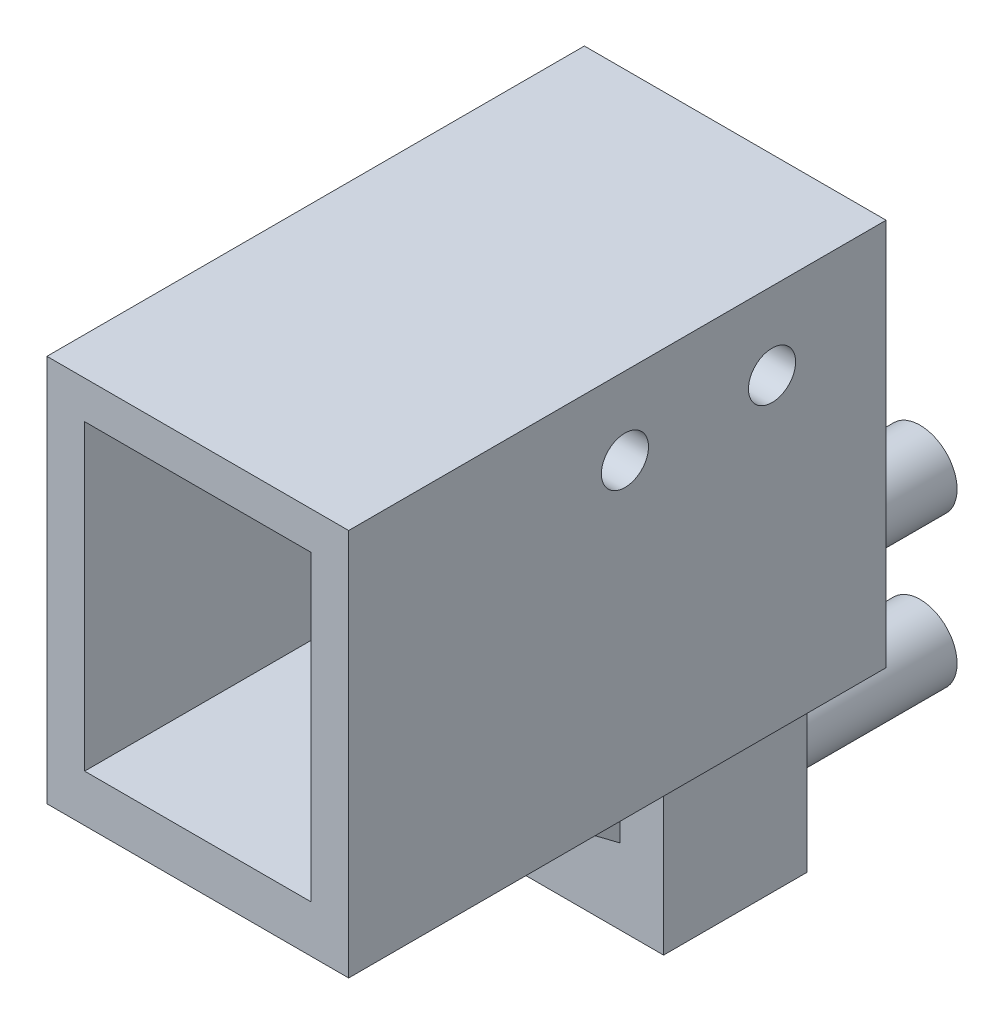
ISO-10303-21;
HEADER;
FILE_DESCRIPTION(('STEP AP214'),'2;1');
FILE_NAME('part.step','',(''),(''),'','','');
FILE_SCHEMA(('AUTOMOTIVE_DESIGN { 1 0 10303 214 1 1 1 1 }'));
ENDSEC;
DATA;
#1=APPLICATION_CONTEXT('core data for automotive mechanical design processes');
#2=APPLICATION_PROTOCOL_DEFINITION('international standard','automotive_design',2000,#1);
#3=PRODUCT_CONTEXT('',#1,'mechanical');
#4=PRODUCT('Part','Part','',(#3));
#5=PRODUCT_RELATED_PRODUCT_CATEGORY('part','',(#4));
#6=PRODUCT_DEFINITION_FORMATION('','',#4);
#7=PRODUCT_DEFINITION_CONTEXT('part definition',#1,'design');
#8=PRODUCT_DEFINITION('design','',#6,#7);
#9=PRODUCT_DEFINITION_SHAPE('','',#8);
#10=(LENGTH_UNIT() NAMED_UNIT(*) SI_UNIT(.MILLI.,.METRE.));
#11=(NAMED_UNIT(*) PLANE_ANGLE_UNIT() SI_UNIT($,.RADIAN.));
#12=(NAMED_UNIT(*) SI_UNIT($,.STERADIAN.) SOLID_ANGLE_UNIT());
#13=UNCERTAINTY_MEASURE_WITH_UNIT(LENGTH_MEASURE(1.E-05),#10,'distance_accuracy_value','');
#14=(GEOMETRIC_REPRESENTATION_CONTEXT(3) GLOBAL_UNCERTAINTY_ASSIGNED_CONTEXT((#13)) GLOBAL_UNIT_ASSIGNED_CONTEXT((#10,
#11,#12)) REPRESENTATION_CONTEXT('',''));
#15=CARTESIAN_POINT('',(0.,0.,0.));
#16=DIRECTION('',(0.,0.,1.));
#17=DIRECTION('',(1.,0.,0.));
#18=AXIS2_PLACEMENT_3D('',#15,#16,#17);
#19=CARTESIAN_POINT('',(0.,14.,0.));
#20=DIRECTION('',(0.,-1.,0.));
#21=DIRECTION('',(0.,0.,-1.));
#22=AXIS2_PLACEMENT_3D('',#19,#20,#21);
#23=PLANE('',#22);
#24=DIRECTION('',(0.,0.,-1.));
#25=VECTOR('',#24,1.);
#26=CARTESIAN_POINT('',(-12.,14.,97.6411649942246));
#27=LINE('',#26,#25);
#28=CARTESIAN_POINT('',(-12.,14.,49.4));
#29=VERTEX_POINT('',#28);
#30=CARTESIAN_POINT('',(-12.,14.,-7.6));
#31=VERTEX_POINT('',#30);
#32=EDGE_CURVE('E200',#29,#31,#27,.T.);
#33=ORIENTED_EDGE('',*,*,#32,.F.);
#34=DIRECTION('',(1.,0.,0.));
#35=VECTOR('',#34,1.);
#36=CARTESIAN_POINT('',(-16.,14.,49.4));
#37=LINE('',#36,#35);
#38=CARTESIAN_POINT('',(12.,14.,49.4));
#39=VERTEX_POINT('',#38);
#40=EDGE_CURVE('E221',#29,#39,#37,.T.);
#41=ORIENTED_EDGE('',*,*,#40,.T.);
#42=DIRECTION('',(0.,0.,-1.));
#43=VECTOR('',#42,1.);
#44=CARTESIAN_POINT('',(12.,14.,97.6411649942246));
#45=LINE('',#44,#43);
#46=CARTESIAN_POINT('',(12.,14.,-7.6));
#47=VERTEX_POINT('',#46);
#48=EDGE_CURVE('E211',#39,#47,#45,.T.);
#49=ORIENTED_EDGE('',*,*,#48,.T.);
#50=DIRECTION('',(-1.,0.,0.));
#51=VECTOR('',#50,1.);
#52=CARTESIAN_POINT('',(-7.6,14.,-7.6));
#53=LINE('',#52,#51);
#54=EDGE_CURVE('E70',#47,#31,#53,.T.);
#55=ORIENTED_EDGE('',*,*,#54,.T.);
#56=EDGE_LOOP('',(#33,#41,#49,#55));
#57=FACE_BOUND('',#56,.T.);
#58=ADVANCED_FACE('F44',(#57),#23,.F.);
#59=CARTESIAN_POINT('',(-7.6,14.,7.6));
#60=DIRECTION('',(1.,0.,0.));
#61=DIRECTION('',(0.,0.,-1.));
#62=AXIS2_PLACEMENT_3D('',#59,#60,#61);
#63=PLANE('',#62);
#64=DIRECTION('',(0.,-1.,0.));
#65=VECTOR('',#64,1.);
#66=CARTESIAN_POINT('',(-7.6,14.,7.6));
#67=LINE('',#66,#65);
#68=CARTESIAN_POINT('',(-7.6,9.,7.6));
#69=VERTEX_POINT('',#68);
#70=CARTESIAN_POINT('',(-7.6,-14.,7.6));
#71=VERTEX_POINT('',#70);
#72=EDGE_CURVE('E11',#69,#71,#67,.T.);
#73=ORIENTED_EDGE('',*,*,#72,.F.);
#74=DIRECTION('',(0.,0.,-1.));
#75=VECTOR('',#74,1.);
#76=CARTESIAN_POINT('',(-7.6,9.,7.6));
#77=LINE('',#76,#75);
#78=CARTESIAN_POINT('',(-7.6,9.,-7.6));
#79=VERTEX_POINT('',#78);
#80=EDGE_CURVE('E284',#69,#79,#77,.T.);
#81=ORIENTED_EDGE('',*,*,#80,.T.);
#82=DIRECTION('',(0.,-1.,0.));
#83=VECTOR('',#82,1.);
#84=CARTESIAN_POINT('',(-7.6,14.,-7.6));
#85=LINE('',#84,#83);
#86=CARTESIAN_POINT('',(-7.6,-14.,-7.6));
#87=VERTEX_POINT('',#86);
#88=EDGE_CURVE('E307',#79,#87,#85,.T.);
#89=ORIENTED_EDGE('',*,*,#88,.T.);
#90=DIRECTION('',(0.,0.,1.));
#91=VECTOR('',#90,1.);
#92=CARTESIAN_POINT('',(-7.6,-14.,7.6));
#93=LINE('',#92,#91);
#94=EDGE_CURVE('E301',#87,#71,#93,.T.);
#95=ORIENTED_EDGE('',*,*,#94,.T.);
#96=EDGE_LOOP('',(#73,#81,#89,#95));
#97=FACE_BOUND('',#96,.T.);
#98=ADVANCED_FACE('F46',(#97),#63,.F.);
#99=CARTESIAN_POINT('',(-7.6,14.,7.6));
#100=DIRECTION('',(0.,0.,-1.));
#101=DIRECTION('',(-1.,0.,0.));
#102=AXIS2_PLACEMENT_3D('',#99,#100,#101);
#103=PLANE('',#102);
#104=DIRECTION('',(-1.,0.,0.));
#105=VECTOR('',#104,1.);
#106=CARTESIAN_POINT('',(-7.6,9.,7.6));
#107=LINE('',#106,#105);
#108=CARTESIAN_POINT('',(7.6,9.,7.6));
#109=VERTEX_POINT('',#108);
#110=CARTESIAN_POINT('',(3.,9.,7.6));
#111=VERTEX_POINT('',#110);
#112=EDGE_CURVE('E177',#109,#111,#107,.T.);
#113=ORIENTED_EDGE('',*,*,#112,.T.);
#114=DIRECTION('',(0.,1.,0.));
#115=VECTOR('',#114,1.);
#116=CARTESIAN_POINT('',(3.,-6.,7.6));
#117=LINE('',#116,#115);
#118=CARTESIAN_POINT('',(3.,-6.,7.6));
#119=VERTEX_POINT('',#118);
#120=EDGE_CURVE('E157',#119,#111,#117,.T.);
#121=ORIENTED_EDGE('',*,*,#120,.F.);
#122=DIRECTION('',(-1.,0.,0.));
#123=VECTOR('',#122,1.);
#124=CARTESIAN_POINT('',(3.,-6.,7.6));
#125=LINE('',#124,#123);
#126=CARTESIAN_POINT('',(-3.,-6.,7.6));
#127=VERTEX_POINT('',#126);
#128=EDGE_CURVE('E166',#119,#127,#125,.T.);
#129=ORIENTED_EDGE('',*,*,#128,.T.);
#130=DIRECTION('',(0.,1.,0.));
#131=VECTOR('',#130,1.);
#132=CARTESIAN_POINT('',(-3.,-6.,7.6));
#133=LINE('',#132,#131);
#134=CARTESIAN_POINT('',(-3.,9.,7.6));
#135=VERTEX_POINT('',#134);
#136=EDGE_CURVE('E186',#127,#135,#133,.T.);
#137=ORIENTED_EDGE('',*,*,#136,.T.);
#138=EDGE_CURVE('E281',#135,#69,#107,.T.);
#139=ORIENTED_EDGE('',*,*,#138,.T.);
#140=ORIENTED_EDGE('',*,*,#72,.T.);
#141=DIRECTION('',(1.,0.,0.));
#142=VECTOR('',#141,1.);
#143=CARTESIAN_POINT('',(-7.6,-14.,7.6));
#144=LINE('',#143,#142);
#145=CARTESIAN_POINT('',(7.6,-14.,7.6));
#146=VERTEX_POINT('',#145);
#147=EDGE_CURVE('E312',#71,#146,#144,.T.);
#148=ORIENTED_EDGE('',*,*,#147,.T.);
#149=DIRECTION('',(0.,-1.,0.));
#150=VECTOR('',#149,1.);
#151=CARTESIAN_POINT('',(7.6,14.,7.6));
#152=LINE('',#151,#150);
#153=EDGE_CURVE('E54',#109,#146,#152,.T.);
#154=ORIENTED_EDGE('',*,*,#153,.F.);
#155=EDGE_LOOP('',(#113,#121,#129,#137,#139,#140,#148,#154));
#156=FACE_BOUND('',#155,.T.);
#157=ADVANCED_FACE('F175',(#156),#103,.F.);
#158=CARTESIAN_POINT('',(7.6,14.,7.6));
#159=DIRECTION('',(-1.,0.,0.));
#160=DIRECTION('',(0.,0.,1.));
#161=AXIS2_PLACEMENT_3D('',#158,#159,#160);
#162=PLANE('',#161);
#163=DIRECTION('',(0.,-1.,0.));
#164=VECTOR('',#163,1.);
#165=CARTESIAN_POINT('',(7.6,14.,-7.6));
#166=LINE('',#165,#164);
#167=CARTESIAN_POINT('',(7.6,9.,-7.6));
#168=VERTEX_POINT('',#167);
#169=CARTESIAN_POINT('',(7.6,-14.,-7.6));
#170=VERTEX_POINT('',#169);
#171=EDGE_CURVE('E325',#168,#170,#166,.T.);
#172=ORIENTED_EDGE('',*,*,#171,.F.);
#173=DIRECTION('',(0.,0.,1.));
#174=VECTOR('',#173,1.);
#175=CARTESIAN_POINT('',(7.6,9.,7.6));
#176=LINE('',#175,#174);
#177=EDGE_CURVE('E269',#168,#109,#176,.T.);
#178=ORIENTED_EDGE('',*,*,#177,.T.);
#179=ORIENTED_EDGE('',*,*,#153,.T.);
#180=DIRECTION('',(0.,0.,-1.));
#181=VECTOR('',#180,1.);
#182=CARTESIAN_POINT('',(7.6,-14.,7.6));
#183=LINE('',#182,#181);
#184=EDGE_CURVE('E316',#146,#170,#183,.T.);
#185=ORIENTED_EDGE('',*,*,#184,.T.);
#186=EDGE_LOOP('',(#172,#178,#179,#185));
#187=FACE_BOUND('',#186,.T.);
#188=ADVANCED_FACE('F400',(#187),#162,.F.);
#189=CARTESIAN_POINT('',(-7.6,14.,-7.6));
#190=DIRECTION('',(0.,0.,1.));
#191=DIRECTION('',(1.,0.,0.));
#192=AXIS2_PLACEMENT_3D('',#189,#190,#191);
#193=PLANE('',#192);
#194=DIRECTION('',(0.,1.,0.));
#195=VECTOR('',#194,1.);
#196=CARTESIAN_POINT('',(-12.,0.,-7.6));
#197=LINE('',#196,#195);
#198=CARTESIAN_POINT('',(-12.,46.1,-7.6));
#199=VERTEX_POINT('',#198);
#200=EDGE_CURVE('E195',#31,#199,#197,.T.);
#201=ORIENTED_EDGE('',*,*,#200,.F.);
#202=ORIENTED_EDGE('',*,*,#54,.F.);
#203=DIRECTION('',(0.,-1.,0.));
#204=VECTOR('',#203,1.);
#205=CARTESIAN_POINT('',(12.,0.,-7.6));
#206=LINE('',#205,#204);
#207=CARTESIAN_POINT('',(12.,46.1,-7.6));
#208=VERTEX_POINT('',#207);
#209=EDGE_CURVE('E207',#208,#47,#206,.T.);
#210=ORIENTED_EDGE('',*,*,#209,.F.);
#211=DIRECTION('',(-1.,0.,0.));
#212=VECTOR('',#211,1.);
#213=CARTESIAN_POINT('',(0.,46.1,-7.6));
#214=LINE('',#213,#212);
#215=EDGE_CURVE('E201',#208,#199,#214,.T.);
#216=ORIENTED_EDGE('',*,*,#215,.T.);
#217=EDGE_LOOP('',(#201,#202,#210,#216));
#218=FACE_BOUND('',#217,.T.);
#219=CARTESIAN_POINT('',(0.,9.55,-7.6));
#220=DIRECTION('',(0.,0.,1.));
#221=DIRECTION('',(1.,0.,0.));
#222=AXIS2_PLACEMENT_3D('',#219,#220,#221);
#223=CIRCLE('',#222,3.925);
#224=CARTESIAN_POINT('',(3.925,9.55,-7.6));
#225=VERTEX_POINT('',#224);
#226=EDGE_CURVE('E289',#225,#225,#223,.T.);
#227=ORIENTED_EDGE('',*,*,#226,.T.);
#228=EDGE_LOOP('',(#227));
#229=FACE_BOUND('',#228,.T.);
#230=ORIENTED_EDGE('',*,*,#88,.F.);
#231=DIRECTION('',(-1.,0.,0.));
#232=VECTOR('',#231,1.);
#233=CARTESIAN_POINT('',(-16.,9.,-7.6));
#234=LINE('',#233,#232);
#235=CARTESIAN_POINT('',(-16.,9.,-7.6));
#236=VERTEX_POINT('',#235);
#237=EDGE_CURVE('E258',#79,#236,#234,.T.);
#238=ORIENTED_EDGE('',*,*,#237,.T.);
#239=DIRECTION('',(0.,1.,0.));
#240=VECTOR('',#239,1.);
#241=CARTESIAN_POINT('',(-16.,9.,-7.6));
#242=LINE('',#241,#240);
#243=CARTESIAN_POINT('',(-16.,50.1,-7.6));
#244=VERTEX_POINT('',#243);
#245=EDGE_CURVE('E266',#236,#244,#242,.T.);
#246=ORIENTED_EDGE('',*,*,#245,.T.);
#247=DIRECTION('',(-1.,0.,0.));
#248=VECTOR('',#247,1.);
#249=CARTESIAN_POINT('',(0.,50.1,-7.6));
#250=LINE('',#249,#248);
#251=CARTESIAN_POINT('',(16.,50.1,-7.6));
#252=VERTEX_POINT('',#251);
#253=EDGE_CURVE('E206',#252,#244,#250,.T.);
#254=ORIENTED_EDGE('',*,*,#253,.F.);
#255=DIRECTION('',(0.,1.,0.));
#256=VECTOR('',#255,1.);
#257=CARTESIAN_POINT('',(16.,9.,-7.6));
#258=LINE('',#257,#256);
#259=CARTESIAN_POINT('',(16.,9.,-7.6));
#260=VERTEX_POINT('',#259);
#261=EDGE_CURVE('E270',#260,#252,#258,.T.);
#262=ORIENTED_EDGE('',*,*,#261,.F.);
#263=EDGE_CURVE('E259',#260,#168,#234,.T.);
#264=ORIENTED_EDGE('',*,*,#263,.T.);
#265=ORIENTED_EDGE('',*,*,#171,.T.);
#266=DIRECTION('',(-1.,0.,0.));
#267=VECTOR('',#266,1.);
#268=CARTESIAN_POINT('',(-7.6,-14.,-7.6));
#269=LINE('',#268,#267);
#270=EDGE_CURVE('E308',#170,#87,#269,.T.);
#271=ORIENTED_EDGE('',*,*,#270,.T.);
#272=EDGE_LOOP('',(#230,#238,#246,#254,#262,#264,#265,#271));
#273=FACE_BOUND('',#272,.T.);
#274=CARTESIAN_POINT('',(0.,-6.45,-7.6));
#275=DIRECTION('',(0.,0.,1.));
#276=DIRECTION('',(1.,0.,0.));
#277=AXIS2_PLACEMENT_3D('',#274,#275,#276);
#278=CIRCLE('',#277,3.925);
#279=CARTESIAN_POINT('',(3.925,-6.45,-7.6));
#280=VERTEX_POINT('',#279);
#281=EDGE_CURVE('E293',#280,#280,#278,.T.);
#282=ORIENTED_EDGE('',*,*,#281,.T.);
#283=EDGE_LOOP('',(#282));
#284=FACE_BOUND('',#283,.T.);
#285=ADVANCED_FACE('F396',(#218,#229,#273,#284),#193,.F.);
#286=CARTESIAN_POINT('',(0.,-14.,0.));
#287=DIRECTION('',(0.,-1.,0.));
#288=DIRECTION('',(0.,0.,-1.));
#289=AXIS2_PLACEMENT_3D('',#286,#287,#288);
#290=PLANE('',#289);
#291=ORIENTED_EDGE('',*,*,#94,.F.);
#292=ORIENTED_EDGE('',*,*,#270,.F.);
#293=ORIENTED_EDGE('',*,*,#184,.F.);
#294=ORIENTED_EDGE('',*,*,#147,.F.);
#295=EDGE_LOOP('',(#291,#292,#293,#294));
#296=FACE_BOUND('',#295,.T.);
#297=ADVANCED_FACE('F393',(#296),#290,.T.);
#298=CARTESIAN_POINT('',(0.,-6.45,-27.2));
#299=DIRECTION('',(0.,0.,1.));
#300=DIRECTION('',(1.,0.,0.));
#301=AXIS2_PLACEMENT_3D('',#298,#299,#300);
#302=CYLINDRICAL_SURFACE('',#301,3.925);
#303=CARTESIAN_POINT('',(0.,-6.45,-27.2));
#304=DIRECTION('',(0.,0.,1.));
#305=DIRECTION('',(1.,0.,0.));
#306=AXIS2_PLACEMENT_3D('',#303,#304,#305);
#307=CIRCLE('',#306,3.925);
#308=CARTESIAN_POINT('',(3.925,-6.45,-27.2));
#309=VERTEX_POINT('',#308);
#310=EDGE_CURVE('E297',#309,#309,#307,.T.);
#311=ORIENTED_EDGE('',*,*,#310,.T.);
#312=EDGE_LOOP('',(#311));
#313=FACE_BOUND('',#312,.T.);
#314=ORIENTED_EDGE('',*,*,#281,.F.);
#315=EDGE_LOOP('',(#314));
#316=FACE_BOUND('',#315,.T.);
#317=ADVANCED_FACE('F391',(#313,#316),#302,.T.);
#318=CARTESIAN_POINT('',(0.,-6.45,-27.2));
#319=DIRECTION('',(0.,0.,1.));
#320=DIRECTION('',(1.,0.,0.));
#321=AXIS2_PLACEMENT_3D('',#318,#319,#320);
#322=PLANE('',#321);
#323=ORIENTED_EDGE('',*,*,#310,.F.);
#324=EDGE_LOOP('',(#323));
#325=FACE_BOUND('',#324,.T.);
#326=ADVANCED_FACE('F431',(#325),#322,.F.);
#327=CARTESIAN_POINT('',(0.,9.55,-27.2));
#328=DIRECTION('',(0.,0.,1.));
#329=DIRECTION('',(1.,0.,0.));
#330=AXIS2_PLACEMENT_3D('',#327,#328,#329);
#331=CYLINDRICAL_SURFACE('',#330,3.925);
#332=CARTESIAN_POINT('',(0.,9.55,-27.2));
#333=DIRECTION('',(0.,0.,1.));
#334=DIRECTION('',(1.,0.,0.));
#335=AXIS2_PLACEMENT_3D('',#332,#333,#334);
#336=CIRCLE('',#335,3.925);
#337=CARTESIAN_POINT('',(3.925,9.55,-27.2));
#338=VERTEX_POINT('',#337);
#339=EDGE_CURVE('E288',#338,#338,#336,.T.);
#340=ORIENTED_EDGE('',*,*,#339,.T.);
#341=EDGE_LOOP('',(#340));
#342=FACE_BOUND('',#341,.T.);
#343=ORIENTED_EDGE('',*,*,#226,.F.);
#344=EDGE_LOOP('',(#343));
#345=FACE_BOUND('',#344,.T.);
#346=ADVANCED_FACE('F438',(#342,#345),#331,.T.);
#347=CARTESIAN_POINT('',(0.,9.55,-27.2));
#348=DIRECTION('',(0.,0.,1.));
#349=DIRECTION('',(1.,0.,0.));
#350=AXIS2_PLACEMENT_3D('',#347,#348,#349);
#351=PLANE('',#350);
#352=ORIENTED_EDGE('',*,*,#339,.F.);
#353=EDGE_LOOP('',(#352));
#354=FACE_BOUND('',#353,.T.);
#355=ADVANCED_FACE('F445',(#354),#351,.F.);
#356=CARTESIAN_POINT('',(0.,9.,0.));
#357=DIRECTION('',(0.,-1.,0.));
#358=DIRECTION('',(0.,0.,-1.));
#359=AXIS2_PLACEMENT_3D('',#356,#357,#358);
#360=PLANE('',#359);
#361=DIRECTION('',(0.,0.,1.));
#362=VECTOR('',#361,1.);
#363=CARTESIAN_POINT('',(3.,9.,7.6));
#364=LINE('',#363,#362);
#365=CARTESIAN_POINT('',(3.,9.,27.6));
#366=VERTEX_POINT('',#365);
#367=EDGE_CURVE('E159',#111,#366,#364,.T.);
#368=ORIENTED_EDGE('',*,*,#367,.F.);
#369=ORIENTED_EDGE('',*,*,#112,.F.);
#370=ORIENTED_EDGE('',*,*,#177,.F.);
#371=ORIENTED_EDGE('',*,*,#263,.F.);
#372=DIRECTION('',(0.,0.,-1.));
#373=VECTOR('',#372,1.);
#374=CARTESIAN_POINT('',(16.,9.,49.4));
#375=LINE('',#374,#373);
#376=CARTESIAN_POINT('',(16.,9.,49.4));
#377=VERTEX_POINT('',#376);
#378=EDGE_CURVE('E254',#377,#260,#375,.T.);
#379=ORIENTED_EDGE('',*,*,#378,.F.);
#380=DIRECTION('',(1.,0.,0.));
#381=VECTOR('',#380,1.);
#382=CARTESIAN_POINT('',(-16.,9.,49.4));
#383=LINE('',#382,#381);
#384=CARTESIAN_POINT('',(-16.,9.,49.4));
#385=VERTEX_POINT('',#384);
#386=EDGE_CURVE('E250',#385,#377,#383,.T.);
#387=ORIENTED_EDGE('',*,*,#386,.F.);
#388=DIRECTION('',(0.,0.,1.));
#389=VECTOR('',#388,1.);
#390=CARTESIAN_POINT('',(-16.,9.,49.4));
#391=LINE('',#390,#389);
#392=EDGE_CURVE('E246',#236,#385,#391,.T.);
#393=ORIENTED_EDGE('',*,*,#392,.F.);
#394=ORIENTED_EDGE('',*,*,#237,.F.);
#395=ORIENTED_EDGE('',*,*,#80,.F.);
#396=ORIENTED_EDGE('',*,*,#138,.F.);
#397=DIRECTION('',(0.,0.,1.));
#398=VECTOR('',#397,1.);
#399=CARTESIAN_POINT('',(-3.,9.,7.6));
#400=LINE('',#399,#398);
#401=CARTESIAN_POINT('',(-3.,9.,27.6));
#402=VERTEX_POINT('',#401);
#403=EDGE_CURVE('E163',#135,#402,#400,.T.);
#404=ORIENTED_EDGE('',*,*,#403,.T.);
#405=DIRECTION('',(-1.,0.,0.));
#406=VECTOR('',#405,1.);
#407=CARTESIAN_POINT('',(3.,9.,27.6));
#408=LINE('',#407,#406);
#409=EDGE_CURVE('E172',#366,#402,#408,.T.);
#410=ORIENTED_EDGE('',*,*,#409,.F.);
#411=EDGE_LOOP('',(#368,#369,#370,#371,#379,#387,#393,#394,#395,#396,#404,#410));
#412=FACE_BOUND('',#411,.T.);
#413=ADVANCED_FACE('F452',(#412),#360,.T.);
#414=CARTESIAN_POINT('',(-16.,9.,49.4));
#415=DIRECTION('',(-1.,0.,0.));
#416=DIRECTION('',(0.,0.,1.));
#417=AXIS2_PLACEMENT_3D('',#414,#415,#416);
#418=PLANE('',#417);
#419=CARTESIAN_POINT('',(-16.,41.9,20.1));
#420=DIRECTION('',(1.,0.,0.));
#421=DIRECTION('',(0.,0.,-1.));
#422=AXIS2_PLACEMENT_3D('',#419,#420,#421);
#423=CIRCLE('',#422,2.5);
#424=CARTESIAN_POINT('',(-16.,41.9,17.6));
#425=VERTEX_POINT('',#424);
#426=EDGE_CURVE('E333',#425,#425,#423,.T.);
#427=ORIENTED_EDGE('',*,*,#426,.T.);
#428=EDGE_LOOP('',(#427));
#429=FACE_BOUND('',#428,.T.);
#430=CARTESIAN_POINT('',(-16.,41.9,4.5));
#431=DIRECTION('',(1.,0.,0.));
#432=DIRECTION('',(0.,0.,-1.));
#433=AXIS2_PLACEMENT_3D('',#430,#431,#432);
#434=CIRCLE('',#433,2.5);
#435=CARTESIAN_POINT('',(-16.,41.9,2.));
#436=VERTEX_POINT('',#435);
#437=EDGE_CURVE('E350',#436,#436,#434,.T.);
#438=ORIENTED_EDGE('',*,*,#437,.T.);
#439=EDGE_LOOP('',(#438));
#440=FACE_BOUND('',#439,.T.);
#441=DIRECTION('',(0.,1.,0.));
#442=VECTOR('',#441,1.);
#443=CARTESIAN_POINT('',(-16.,9.,49.4));
#444=LINE('',#443,#442);
#445=CARTESIAN_POINT('',(-16.,50.1,49.4));
#446=VERTEX_POINT('',#445);
#447=EDGE_CURVE('E263',#385,#446,#444,.T.);
#448=ORIENTED_EDGE('',*,*,#447,.T.);
#449=DIRECTION('',(0.,0.,-1.));
#450=VECTOR('',#449,1.);
#451=CARTESIAN_POINT('',(-16.,50.1,97.6411649942246));
#452=LINE('',#451,#450);
#453=EDGE_CURVE('E171',#446,#244,#452,.T.);
#454=ORIENTED_EDGE('',*,*,#453,.T.);
#455=ORIENTED_EDGE('',*,*,#245,.F.);
#456=ORIENTED_EDGE('',*,*,#392,.T.);
#457=EDGE_LOOP('',(#448,#454,#455,#456));
#458=FACE_BOUND('',#457,.T.);
#459=ADVANCED_FACE('F459',(#429,#440,#458),#418,.T.);
#460=CARTESIAN_POINT('',(16.,9.,49.4));
#461=DIRECTION('',(1.,0.,0.));
#462=DIRECTION('',(0.,0.,-1.));
#463=AXIS2_PLACEMENT_3D('',#460,#461,#462);
#464=PLANE('',#463);
#465=CARTESIAN_POINT('',(16.,41.9,20.1));
#466=DIRECTION('',(1.,0.,0.));
#467=DIRECTION('',(0.,0.,-1.));
#468=AXIS2_PLACEMENT_3D('',#465,#466,#467);
#469=CIRCLE('',#468,2.5);
#470=CARTESIAN_POINT('',(16.,41.9,17.6));
#471=VERTEX_POINT('',#470);
#472=EDGE_CURVE('E341',#471,#471,#469,.T.);
#473=ORIENTED_EDGE('',*,*,#472,.F.);
#474=EDGE_LOOP('',(#473));
#475=FACE_BOUND('',#474,.T.);
#476=CARTESIAN_POINT('',(16.,41.9,4.5));
#477=DIRECTION('',(1.,0.,0.));
#478=DIRECTION('',(0.,0.,-1.));
#479=AXIS2_PLACEMENT_3D('',#476,#477,#478);
#480=CIRCLE('',#479,2.5);
#481=CARTESIAN_POINT('',(16.,41.9,2.));
#482=VERTEX_POINT('',#481);
#483=EDGE_CURVE('E347',#482,#482,#480,.T.);
#484=ORIENTED_EDGE('',*,*,#483,.F.);
#485=EDGE_LOOP('',(#484));
#486=FACE_BOUND('',#485,.T.);
#487=ORIENTED_EDGE('',*,*,#261,.T.);
#488=DIRECTION('',(0.,0.,-1.));
#489=VECTOR('',#488,1.);
#490=CARTESIAN_POINT('',(16.,50.1,97.6411649942246));
#491=LINE('',#490,#489);
#492=CARTESIAN_POINT('',(16.,50.1,49.4));
#493=VERTEX_POINT('',#492);
#494=EDGE_CURVE('E216',#493,#252,#491,.T.);
#495=ORIENTED_EDGE('',*,*,#494,.F.);
#496=DIRECTION('',(0.,1.,0.));
#497=VECTOR('',#496,1.);
#498=CARTESIAN_POINT('',(16.,9.,49.4));
#499=LINE('',#498,#497);
#500=EDGE_CURVE('E273',#377,#493,#499,.T.);
#501=ORIENTED_EDGE('',*,*,#500,.F.);
#502=ORIENTED_EDGE('',*,*,#378,.T.);
#503=EDGE_LOOP('',(#487,#495,#501,#502));
#504=FACE_BOUND('',#503,.T.);
#505=ADVANCED_FACE('F469',(#475,#486,#504),#464,.T.);
#506=CARTESIAN_POINT('',(-16.,9.,49.4));
#507=DIRECTION('',(0.,0.,1.));
#508=DIRECTION('',(1.,0.,0.));
#509=AXIS2_PLACEMENT_3D('',#506,#507,#508);
#510=PLANE('',#509);
#511=ORIENTED_EDGE('',*,*,#40,.F.);
#512=DIRECTION('',(0.,1.,0.));
#513=VECTOR('',#512,1.);
#514=CARTESIAN_POINT('',(-12.,0.,49.4));
#515=LINE('',#514,#513);
#516=CARTESIAN_POINT('',(-12.,46.1,49.4));
#517=VERTEX_POINT('',#516);
#518=EDGE_CURVE('E222',#29,#517,#515,.T.);
#519=ORIENTED_EDGE('',*,*,#518,.T.);
#520=DIRECTION('',(-1.,0.,0.));
#521=VECTOR('',#520,1.);
#522=CARTESIAN_POINT('',(0.,46.1,49.4));
#523=LINE('',#522,#521);
#524=CARTESIAN_POINT('',(12.,46.1,49.4));
#525=VERTEX_POINT('',#524);
#526=EDGE_CURVE('E199',#525,#517,#523,.T.);
#527=ORIENTED_EDGE('',*,*,#526,.F.);
#528=DIRECTION('',(0.,-1.,0.));
#529=VECTOR('',#528,1.);
#530=CARTESIAN_POINT('',(12.,0.,49.4));
#531=LINE('',#530,#529);
#532=EDGE_CURVE('E217',#525,#39,#531,.T.);
#533=ORIENTED_EDGE('',*,*,#532,.T.);
#534=EDGE_LOOP('',(#511,#519,#527,#533));
#535=FACE_BOUND('',#534,.T.);
#536=DIRECTION('',(-1.,0.,0.));
#537=VECTOR('',#536,1.);
#538=CARTESIAN_POINT('',(0.,50.1,49.4));
#539=LINE('',#538,#537);
#540=EDGE_CURVE('E205',#493,#446,#539,.T.);
#541=ORIENTED_EDGE('',*,*,#540,.T.);
#542=ORIENTED_EDGE('',*,*,#447,.F.);
#543=ORIENTED_EDGE('',*,*,#386,.T.);
#544=ORIENTED_EDGE('',*,*,#500,.T.);
#545=EDGE_LOOP('',(#541,#542,#543,#544));
#546=FACE_BOUND('',#545,.T.);
#547=ADVANCED_FACE('F481',(#535,#546),#510,.T.);
#548=CARTESIAN_POINT('',(-12.,0.,97.6411649942246));
#549=DIRECTION('',(-1.,0.,0.));
#550=DIRECTION('',(0.,-1.,0.));
#551=AXIS2_PLACEMENT_3D('',#548,#549,#550);
#552=PLANE('',#551);
#553=CARTESIAN_POINT('',(-12.,41.9,20.1));
#554=DIRECTION('',(-1.,0.,0.));
#555=DIRECTION('',(0.,-1.,0.));
#556=AXIS2_PLACEMENT_3D('',#553,#554,#555);
#557=CIRCLE('',#556,2.5);
#558=CARTESIAN_POINT('',(-12.,39.4,20.1));
#559=VERTEX_POINT('',#558);
#560=EDGE_CURVE('E187',#559,#559,#557,.T.);
#561=ORIENTED_EDGE('',*,*,#560,.T.);
#562=EDGE_LOOP('',(#561));
#563=FACE_BOUND('',#562,.T.);
#564=CARTESIAN_POINT('',(-12.,41.9,4.5));
#565=DIRECTION('',(-1.,0.,0.));
#566=DIRECTION('',(0.,-1.,0.));
#567=AXIS2_PLACEMENT_3D('',#564,#565,#566);
#568=CIRCLE('',#567,2.5);
#569=CARTESIAN_POINT('',(-12.,39.4,4.5));
#570=VERTEX_POINT('',#569);
#571=EDGE_CURVE('E332',#570,#570,#568,.T.);
#572=ORIENTED_EDGE('',*,*,#571,.T.);
#573=EDGE_LOOP('',(#572));
#574=FACE_BOUND('',#573,.T.);
#575=ORIENTED_EDGE('',*,*,#518,.F.);
#576=ORIENTED_EDGE('',*,*,#32,.T.);
#577=ORIENTED_EDGE('',*,*,#200,.T.);
#578=DIRECTION('',(0.,0.,-1.));
#579=VECTOR('',#578,1.);
#580=CARTESIAN_POINT('',(-12.,46.1,97.6411649942246));
#581=LINE('',#580,#579);
#582=EDGE_CURVE('E225',#517,#199,#581,.T.);
#583=ORIENTED_EDGE('',*,*,#582,.F.);
#584=EDGE_LOOP('',(#575,#576,#577,#583));
#585=FACE_BOUND('',#584,.T.);
#586=ADVANCED_FACE('F491',(#563,#574,#585),#552,.F.);
#587=CARTESIAN_POINT('',(0.,46.1,97.6411649942246));
#588=DIRECTION('',(0.,-1.,0.));
#589=DIRECTION('',(0.,0.,-1.));
#590=AXIS2_PLACEMENT_3D('',#587,#588,#589);
#591=PLANE('',#590);
#592=DIRECTION('',(0.,0.,-1.));
#593=VECTOR('',#592,1.);
#594=CARTESIAN_POINT('',(12.,46.1,97.6411649942246));
#595=LINE('',#594,#593);
#596=EDGE_CURVE('E212',#525,#208,#595,.T.);
#597=ORIENTED_EDGE('',*,*,#596,.F.);
#598=ORIENTED_EDGE('',*,*,#526,.T.);
#599=ORIENTED_EDGE('',*,*,#582,.T.);
#600=ORIENTED_EDGE('',*,*,#215,.F.);
#601=EDGE_LOOP('',(#597,#598,#599,#600));
#602=FACE_BOUND('',#601,.T.);
#603=ADVANCED_FACE('F499',(#602),#591,.T.);
#604=CARTESIAN_POINT('',(12.,0.,97.6411649942246));
#605=DIRECTION('',(1.,0.,0.));
#606=DIRECTION('',(0.,1.,0.));
#607=AXIS2_PLACEMENT_3D('',#604,#605,#606);
#608=PLANE('',#607);
#609=CARTESIAN_POINT('',(12.,41.9,20.1));
#610=DIRECTION('',(1.,0.,0.));
#611=DIRECTION('',(0.,1.,0.));
#612=AXIS2_PLACEMENT_3D('',#609,#610,#611);
#613=CIRCLE('',#612,2.5);
#614=CARTESIAN_POINT('',(12.,44.4,20.1));
#615=VERTEX_POINT('',#614);
#616=EDGE_CURVE('E48',#615,#615,#613,.T.);
#617=ORIENTED_EDGE('',*,*,#616,.T.);
#618=EDGE_LOOP('',(#617));
#619=FACE_BOUND('',#618,.T.);
#620=CARTESIAN_POINT('',(12.,41.9,4.5));
#621=DIRECTION('',(1.,0.,0.));
#622=DIRECTION('',(0.,1.,0.));
#623=AXIS2_PLACEMENT_3D('',#620,#621,#622);
#624=CIRCLE('',#623,2.5);
#625=CARTESIAN_POINT('',(12.,44.4,4.5));
#626=VERTEX_POINT('',#625);
#627=EDGE_CURVE('E329',#626,#626,#624,.T.);
#628=ORIENTED_EDGE('',*,*,#627,.T.);
#629=EDGE_LOOP('',(#628));
#630=FACE_BOUND('',#629,.T.);
#631=ORIENTED_EDGE('',*,*,#532,.F.);
#632=ORIENTED_EDGE('',*,*,#596,.T.);
#633=ORIENTED_EDGE('',*,*,#209,.T.);
#634=ORIENTED_EDGE('',*,*,#48,.F.);
#635=EDGE_LOOP('',(#631,#632,#633,#634));
#636=FACE_BOUND('',#635,.T.);
#637=ADVANCED_FACE('F364',(#619,#630,#636),#608,.F.);
#638=CARTESIAN_POINT('',(0.,50.1,97.6411649942246));
#639=DIRECTION('',(0.,-1.,0.));
#640=DIRECTION('',(0.,0.,-1.));
#641=AXIS2_PLACEMENT_3D('',#638,#639,#640);
#642=PLANE('',#641);
#643=ORIENTED_EDGE('',*,*,#540,.F.);
#644=ORIENTED_EDGE('',*,*,#494,.T.);
#645=ORIENTED_EDGE('',*,*,#253,.T.);
#646=ORIENTED_EDGE('',*,*,#453,.F.);
#647=EDGE_LOOP('',(#643,#644,#645,#646));
#648=FACE_BOUND('',#647,.T.);
#649=ADVANCED_FACE('F515',(#648),#642,.F.);
#650=CARTESIAN_POINT('',(3.,9.,27.6));
#651=DIRECTION('',(0.,0.8,-0.6));
#652=DIRECTION('',(0.,0.6,0.8));
#653=AXIS2_PLACEMENT_3D('',#650,#651,#652);
#654=PLANE('',#653);
#655=DIRECTION('',(0.,-0.6,-0.8));
#656=VECTOR('',#655,1.);
#657=CARTESIAN_POINT('',(-3.,9.,27.6));
#658=LINE('',#657,#656);
#659=EDGE_CURVE('E62',#402,#127,#658,.T.);
#660=ORIENTED_EDGE('',*,*,#659,.T.);
#661=ORIENTED_EDGE('',*,*,#128,.F.);
#662=DIRECTION('',(0.,-0.6,-0.8));
#663=VECTOR('',#662,1.);
#664=CARTESIAN_POINT('',(3.,9.,27.6));
#665=LINE('',#664,#663);
#666=EDGE_CURVE('E153',#366,#119,#665,.T.);
#667=ORIENTED_EDGE('',*,*,#666,.F.);
#668=ORIENTED_EDGE('',*,*,#409,.T.);
#669=EDGE_LOOP('',(#660,#661,#667,#668));
#670=FACE_BOUND('',#669,.T.);
#671=ADVANCED_FACE('F167',(#670),#654,.F.);
#672=CARTESIAN_POINT('',(3.,0.,0.));
#673=DIRECTION('',(1.,0.,0.));
#674=DIRECTION('',(0.,0.,-1.));
#675=AXIS2_PLACEMENT_3D('',#672,#673,#674);
#676=PLANE('',#675);
#677=ORIENTED_EDGE('',*,*,#666,.T.);
#678=ORIENTED_EDGE('',*,*,#120,.T.);
#679=ORIENTED_EDGE('',*,*,#367,.T.);
#680=EDGE_LOOP('',(#677,#678,#679));
#681=FACE_BOUND('',#680,.T.);
#682=ADVANCED_FACE('F155',(#681),#676,.T.);
#683=CARTESIAN_POINT('',(-3.,0.,0.));
#684=DIRECTION('',(1.,0.,0.));
#685=DIRECTION('',(0.,0.,-1.));
#686=AXIS2_PLACEMENT_3D('',#683,#684,#685);
#687=PLANE('',#686);
#688=ORIENTED_EDGE('',*,*,#659,.F.);
#689=ORIENTED_EDGE('',*,*,#403,.F.);
#690=ORIENTED_EDGE('',*,*,#136,.F.);
#691=EDGE_LOOP('',(#688,#689,#690));
#692=FACE_BOUND('',#691,.T.);
#693=ADVANCED_FACE('F379',(#692),#687,.F.);
#694=CARTESIAN_POINT('',(-16.,41.9,4.5));
#695=DIRECTION('',(1.,0.,0.));
#696=DIRECTION('',(0.,0.,-1.));
#697=AXIS2_PLACEMENT_3D('',#694,#695,#696);
#698=CYLINDRICAL_SURFACE('',#697,2.5);
#699=ORIENTED_EDGE('',*,*,#483,.T.);
#700=EDGE_LOOP('',(#699));
#701=FACE_BOUND('',#700,.T.);
#702=ORIENTED_EDGE('',*,*,#627,.F.);
#703=EDGE_LOOP('',(#702));
#704=FACE_BOUND('',#703,.T.);
#705=ADVANCED_FACE('F369',(#701,#704),#698,.F.);
#706=CARTESIAN_POINT('',(-16.,41.9,20.1));
#707=DIRECTION('',(1.,0.,0.));
#708=DIRECTION('',(0.,0.,-1.));
#709=AXIS2_PLACEMENT_3D('',#706,#707,#708);
#710=CYLINDRICAL_SURFACE('',#709,2.5);
#711=ORIENTED_EDGE('',*,*,#472,.T.);
#712=EDGE_LOOP('',(#711));
#713=FACE_BOUND('',#712,.T.);
#714=ORIENTED_EDGE('',*,*,#616,.F.);
#715=EDGE_LOOP('',(#714));
#716=FACE_BOUND('',#715,.T.);
#717=ADVANCED_FACE('F366',(#713,#716),#710,.F.);
#718=ORIENTED_EDGE('',*,*,#437,.F.);
#719=EDGE_LOOP('',(#718));
#720=FACE_BOUND('',#719,.T.);
#721=ORIENTED_EDGE('',*,*,#571,.F.);
#722=EDGE_LOOP('',(#721));
#723=FACE_BOUND('',#722,.T.);
#724=ADVANCED_FACE('F368',(#720,#723),#698,.F.);
#725=ORIENTED_EDGE('',*,*,#426,.F.);
#726=EDGE_LOOP('',(#725));
#727=FACE_BOUND('',#726,.T.);
#728=ORIENTED_EDGE('',*,*,#560,.F.);
#729=EDGE_LOOP('',(#728));
#730=FACE_BOUND('',#729,.T.);
#731=ADVANCED_FACE('F372',(#727,#730),#710,.F.);
#732=CLOSED_SHELL('',(#58,#98,#157,#188,#285,#297,#317,#326,#346,#355,#413,#459,#505,#547,#586,
#603,#637,#649,#671,#682,#693,#705,#717,#724,#731));
#733=MANIFOLD_SOLID_BREP('B2',#732);
#734=ADVANCED_BREP_SHAPE_REPRESENTATION('',(#18,#733),#14);
#735=SHAPE_DEFINITION_REPRESENTATION(#9,#734);
ENDSEC;
END-ISO-10303-21;
